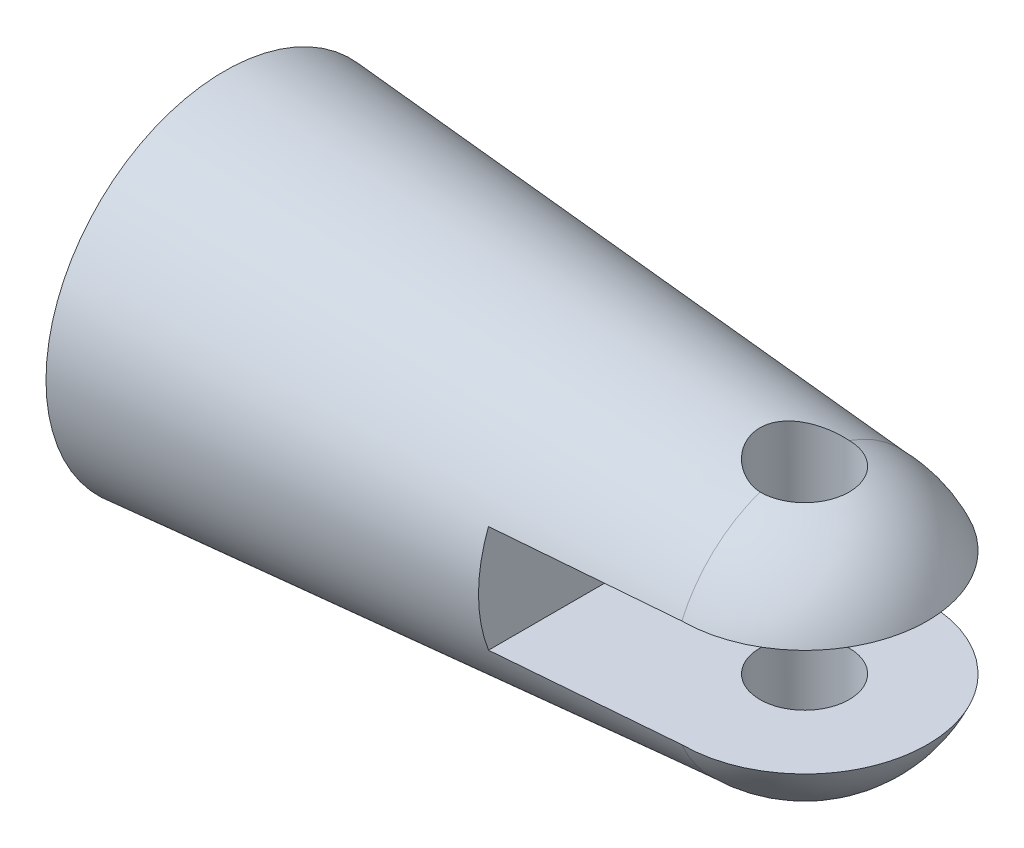
ISO-10303-21;
HEADER;
FILE_DESCRIPTION(('STEP AP214'),'2;1');
FILE_NAME('part.step','',(''),(''),'','','');
FILE_SCHEMA(('AUTOMOTIVE_DESIGN { 1 0 10303 214 1 1 1 1 }'));
ENDSEC;
DATA;
#1=APPLICATION_CONTEXT('core data for automotive mechanical design processes');
#2=APPLICATION_PROTOCOL_DEFINITION('international standard','automotive_design',2000,#1);
#3=PRODUCT_CONTEXT('',#1,'mechanical');
#4=PRODUCT('Part','Part','',(#3));
#5=PRODUCT_RELATED_PRODUCT_CATEGORY('part','',(#4));
#6=PRODUCT_DEFINITION_FORMATION('','',#4);
#7=PRODUCT_DEFINITION_CONTEXT('part definition',#1,'design');
#8=PRODUCT_DEFINITION('design','',#6,#7);
#9=PRODUCT_DEFINITION_SHAPE('','',#8);
#10=(LENGTH_UNIT() NAMED_UNIT(*) SI_UNIT(.MILLI.,.METRE.));
#11=(NAMED_UNIT(*) PLANE_ANGLE_UNIT() SI_UNIT($,.RADIAN.));
#12=(NAMED_UNIT(*) SI_UNIT($,.STERADIAN.) SOLID_ANGLE_UNIT());
#13=UNCERTAINTY_MEASURE_WITH_UNIT(LENGTH_MEASURE(1.E-05),#10,'distance_accuracy_value','');
#14=(GEOMETRIC_REPRESENTATION_CONTEXT(3) GLOBAL_UNCERTAINTY_ASSIGNED_CONTEXT((#13)) GLOBAL_UNIT_ASSIGNED_CONTEXT((#10,
#11,#12)) REPRESENTATION_CONTEXT('',''));
#15=CARTESIAN_POINT('',(0.,0.,0.));
#16=DIRECTION('',(0.,0.,1.));
#17=DIRECTION('',(1.,0.,0.));
#18=AXIS2_PLACEMENT_3D('',#15,#16,#17);
#19=CARTESIAN_POINT('',(65.,0.,0.));
#20=DIRECTION('',(-1.,0.,0.));
#21=DIRECTION('',(0.,0.,1.));
#22=AXIS2_PLACEMENT_3D('',#19,#20,#21);
#23=SPHERICAL_SURFACE('',#22,15.);
#24=CARTESIAN_POINT('',(65.,0.,0.));
#25=DIRECTION('',(-1.,0.,0.));
#26=DIRECTION('',(0.,0.,1.));
#27=AXIS2_PLACEMENT_3D('',#24,#25,#26);
#28=CIRCLE('',#27,15.);
#29=CARTESIAN_POINT('',(65.,-6.,-13.7477270848675));
#30=VERTEX_POINT('',#29);
#31=CARTESIAN_POINT('',(65.,-14.1421356237309,-5.));
#32=VERTEX_POINT('',#31);
#33=EDGE_CURVE('E166',#30,#32,#28,.T.);
#34=ORIENTED_EDGE('',*,*,#33,.F.);
#35=CARTESIAN_POINT('',(65.,-6.,0.));
#36=DIRECTION('',(0.,-1.,0.));
#37=DIRECTION('',(0.,0.,-1.));
#38=AXIS2_PLACEMENT_3D('',#35,#36,#37);
#39=CIRCLE('',#38,13.7477270848675);
#40=CARTESIAN_POINT('',(65.,-6.,13.7477270848675));
#41=VERTEX_POINT('',#40);
#42=EDGE_CURVE('E186',#30,#41,#39,.T.);
#43=ORIENTED_EDGE('',*,*,#42,.T.);
#44=CARTESIAN_POINT('',(65.,-14.1421356237309,5.));
#45=VERTEX_POINT('',#44);
#46=EDGE_CURVE('E167',#45,#41,#28,.T.);
#47=ORIENTED_EDGE('',*,*,#46,.F.);
#48=CARTESIAN_POINT('',(65.,-14.1421356237309,0.));
#49=DIRECTION('',(0.,1.,0.));
#50=DIRECTION('',(0.,0.,1.));
#51=AXIS2_PLACEMENT_3D('',#48,#49,#50);
#52=CIRCLE('',#51,5.);
#53=EDGE_CURVE('E54',#45,#32,#52,.T.);
#54=ORIENTED_EDGE('',*,*,#53,.T.);
#55=EDGE_LOOP('',(#34,#43,#47,#54));
#56=FACE_BOUND('',#55,.T.);
#57=ADVANCED_FACE('F32',(#56),#23,.T.);
#58=CARTESIAN_POINT('',(65.,-25.,0.));
#59=DIRECTION('',(0.,1.,0.));
#60=DIRECTION('',(0.,0.,1.));
#61=AXIS2_PLACEMENT_3D('',#58,#59,#60);
#62=CYLINDRICAL_SURFACE('',#61,5.);
#63=CARTESIAN_POINT('',(65.,-6.,0.));
#64=DIRECTION('',(0.,-1.,0.));
#65=DIRECTION('',(0.,0.,-1.));
#66=AXIS2_PLACEMENT_3D('',#63,#64,#65);
#67=CIRCLE('',#66,5.);
#68=CARTESIAN_POINT('',(65.,-6.,-5.));
#69=VERTEX_POINT('',#68);
#70=EDGE_CURVE('E104',#69,#69,#67,.F.);
#71=ORIENTED_EDGE('',*,*,#70,.T.);
#72=EDGE_LOOP('',(#71));
#73=FACE_BOUND('',#72,.T.);
#74=CARTESIAN_POINT('',(65.0002,-14.1421193072953,-4.999999996));
#75=CARTESIAN_POINT('',(64.8609005875466,-14.1534608437372,-5.0000225863422));
#76=CARTESIAN_POINT('',(64.7217923370571,-14.1668866167519,-4.99419041385577));
#77=CARTESIAN_POINT('',(64.445016799748,-14.1975948871605,-4.97103878691973));
#78=CARTESIAN_POINT('',(64.3073489732907,-14.2148758818136,-4.95372380322326));
#79=CARTESIAN_POINT('',(64.0348261194965,-14.2529330553083,-4.90789962909047));
#80=CARTESIAN_POINT('',(63.8999636940416,-14.273698230382,-4.87942531533224));
#81=CARTESIAN_POINT('',(63.6335479228229,-14.3183173494077,-4.81162390853048));
#82=CARTESIAN_POINT('',(63.5019948248338,-14.342171523821,-4.7722960054847));
#83=CARTESIAN_POINT('',(63.1138765137204,-14.4175786529937,-4.63866467403758));
#84=CARTESIAN_POINT('',(62.8632981289187,-14.4730564318507,-4.52861886940065));
#85=CARTESIAN_POINT('',(62.384368679171,-14.5898435089951,-4.2699792846608));
#86=CARTESIAN_POINT('',(62.156035358864,-14.6511573868381,-4.12135507170658));
#87=CARTESIAN_POINT('',(61.7170953084016,-14.7773734187937,-3.78191097099781));
#88=CARTESIAN_POINT('',(61.5077118530436,-14.8423146935315,-3.58952124686318));
#89=CARTESIAN_POINT('',(61.1238025041885,-14.9674864745691,-3.17105708064705));
#90=CARTESIAN_POINT('',(60.94927843781,-15.0277167338454,-2.94498087400758));
#91=CARTESIAN_POINT('',(60.7169860127176,-15.1106361221196,-2.58391323382069));
#92=CARTESIAN_POINT('',(60.6441864400282,-15.1371501511314,-2.45922940167486));
#93=CARTESIAN_POINT('',(60.5094265710204,-15.1869509830121,-2.20354201348524));
#94=CARTESIAN_POINT('',(60.4474615558479,-15.210239189924,-2.07254124058082));
#95=CARTESIAN_POINT('',(60.334959987426,-15.2530036865838,-1.80511880092982));
#96=CARTESIAN_POINT('',(60.2844239124051,-15.2724798168161,-1.66869690762459));
#97=CARTESIAN_POINT('',(60.1953322434207,-15.3071037620531,-1.39152484233197));
#98=CARTESIAN_POINT('',(60.1567707485258,-15.3222537086531,-1.25077683990067));
#99=CARTESIAN_POINT('',(60.0939583186109,-15.3470686079975,-0.974485122996998));
#100=CARTESIAN_POINT('',(60.0689945363965,-15.3570054826469,-0.839127535155646));
#101=CARTESIAN_POINT('',(60.0303049449088,-15.3724500042564,-0.566621106993163));
#102=CARTESIAN_POINT('',(60.016574211302,-15.3779595920277,-0.429473078381503));
#103=CARTESIAN_POINT('',(60.0004864780599,-15.384418087117,-0.15441280113628));
#104=CARTESIAN_POINT('',(59.9981287958165,-15.3853672681498,-0.0165005988656904));
#105=CARTESIAN_POINT('',(60.0048119493913,-15.3826816663833,0.259000611715447));
#106=CARTESIAN_POINT('',(60.013852497281,-15.3790469993758,0.396589628101971));
#107=CARTESIAN_POINT('',(60.0424995253958,-15.3675781841497,0.663557253225277));
#108=CARTESIAN_POINT('',(60.0615591513602,-15.3599614880038,0.793004349349737));
#109=CARTESIAN_POINT('',(60.1096984642036,-15.3408402213671,1.04977158485662));
#110=CARTESIAN_POINT('',(60.1387814910877,-15.3293343549487,1.17709100040544));
#111=CARTESIAN_POINT('',(60.206686844041,-15.3026896875985,1.42867536269365));
#112=CARTESIAN_POINT('',(60.2455059968721,-15.2875520704115,1.55294129017765));
#113=CARTESIAN_POINT('',(60.3325387199748,-15.2539684267451,1.79769427079882));
#114=CARTESIAN_POINT('',(60.3807558518708,-15.2355211461885,1.91817987111528));
#115=CARTESIAN_POINT('',(60.5410583139958,-15.174966475539,2.27759399406916));
#116=CARTESIAN_POINT('',(60.6674588144673,-15.1281874213997,2.50954528441505));
#117=CARTESIAN_POINT('',(60.9539725990488,-15.0261839899758,2.94935465283195));
#118=CARTESIAN_POINT('',(61.114095894487,-14.970957106109,3.15720554771282));
#119=CARTESIAN_POINT('',(61.4755186048973,-14.8525304287999,3.55744075823097));
#120=CARTESIAN_POINT('',(61.6788221560584,-14.7890455678859,3.74793276893805));
#121=CARTESIAN_POINT('',(62.1145163598661,-14.6625540751018,4.09281675934621));
#122=CARTESIAN_POINT('',(62.3469233271463,-14.5995477326551,4.24718835052858));
#123=CARTESIAN_POINT('',(62.717495282686,-14.50836869236,4.45096578748352));
#124=CARTESIAN_POINT('',(62.8472112755162,-14.4780201112727,4.51514139961249));
#125=CARTESIAN_POINT('',(63.1121332569952,-14.4196040907575,4.63215893520772));
#126=CARTESIAN_POINT('',(63.2473370167758,-14.3915357388412,4.68500540631588));
#127=CARTESIAN_POINT('',(63.5221686367712,-14.3383758453878,4.77881550778364));
#128=CARTESIAN_POINT('',(63.661790603614,-14.3132805340369,4.8197942837722));
#129=CARTESIAN_POINT('',(63.9445764469822,-14.2666235530336,4.88950647954905));
#130=CARTESIAN_POINT('',(64.0877385523473,-14.2450601559178,4.91824589669402));
#131=CARTESIAN_POINT('',(64.3588410406606,-14.2083528037028,4.96037789081176));
#132=CARTESIAN_POINT('',(64.4864950220597,-14.1927458966252,4.97522032786196));
#133=CARTESIAN_POINT('',(64.74277862676,-14.1648762323326,4.9950344752248));
#134=CARTESIAN_POINT('',(64.871406968408,-14.1526096738722,5.00001744622238));
#135=CARTESIAN_POINT('',(65.0002,-14.1421193072953,4.999999996));
#136=B_SPLINE_CURVE_WITH_KNOTS('',3,(#74,#75,#76,#77,#78,#79,#80,#81,#82,#83,#84,#85,#86,#87,
#88,#89,#90,#91,#92,#93,#94,#95,#96,#97,#98,#99,#100,#101,#102,#103,#104,#105,#106,#107,#108,
#109,#110,#111,#112,#113,#114,#115,#116,#117,#118,#119,#120,#121,#122,#123,#124,#125,#126,#127,
#128,#129,#130,#131,#132,#133,#134,#135),.UNSPECIFIED.,.F.,.F.,(4,2,2,2,2,2,2,2,2,2,2,2,2,2,2,2,
2,2,2,2,2,2,2,2,2,2,2,2,2,2,4),(0.,0.419109986977874,0.838056892105409,1.25570475636498,
1.67338379807427,2.50705933012206,3.34139452233439,4.21246806699396,5.08358725608813,
5.52350086127665,5.96322238781629,6.40296231049794,6.84248518940088,7.25595193962768,
7.66923733740647,8.08249792957055,8.49574808264965,8.88848145927065,9.28134582952969,
9.67408232183646,10.0669679429257,10.8679803862637,11.6692309632158,12.5227287522758,
13.3767071504001,13.8198593583499,14.2628333456567,14.7052394900283,15.1474286027029,
15.5353886656417,15.9229053756085),.UNSPECIFIED.);
#137=EDGE_CURVE('E133',#32,#45,#136,.T.);
#138=ORIENTED_EDGE('',*,*,#137,.F.);
#139=ORIENTED_EDGE('',*,*,#53,.F.);
#140=EDGE_LOOP('',(#138,#139));
#141=FACE_BOUND('',#140,.T.);
#142=ADVANCED_FACE('F200',(#73,#141),#62,.F.);
#143=CARTESIAN_POINT('',(0.,0.,0.));
#144=DIRECTION('',(1.,0.,0.));
#145=DIRECTION('',(0.,0.,-1.));
#146=AXIS2_PLACEMENT_3D('',#143,#144,#145);
#147=PLANE('',#146);
#148=CARTESIAN_POINT('',(0.,0.,0.));
#149=DIRECTION('',(-1.,0.,0.));
#150=DIRECTION('',(0.,0.,1.));
#151=AXIS2_PLACEMENT_3D('',#148,#149,#150);
#152=CIRCLE('',#151,20.);
#153=CARTESIAN_POINT('',(0.,0.,20.));
#154=VERTEX_POINT('',#153);
#155=EDGE_CURVE('E170',#154,#154,#152,.T.);
#156=ORIENTED_EDGE('',*,*,#155,.T.);
#157=EDGE_LOOP('',(#156));
#158=FACE_BOUND('',#157,.T.);
#159=CARTESIAN_POINT('',(0.,0.,0.));
#160=DIRECTION('',(1.,0.,0.));
#161=DIRECTION('',(0.,0.,-1.));
#162=AXIS2_PLACEMENT_3D('',#159,#160,#161);
#163=CIRCLE('',#162,8.);
#164=CARTESIAN_POINT('',(0.,0.,-8.));
#165=VERTEX_POINT('',#164);
#166=EDGE_CURVE('E159',#165,#165,#163,.F.);
#167=ORIENTED_EDGE('',*,*,#166,.F.);
#168=EDGE_LOOP('',(#167));
#169=FACE_BOUND('',#168,.T.);
#170=ADVANCED_FACE('F128',(#158,#169),#147,.F.);
#171=CARTESIAN_POINT('',(65.,6.,13.7477270848675));
#172=VERTEX_POINT('',#171);
#173=CARTESIAN_POINT('',(65.,14.1421356237309,5.));
#174=VERTEX_POINT('',#173);
#175=EDGE_CURVE('E168',#172,#174,#28,.T.);
#176=ORIENTED_EDGE('',*,*,#175,.F.);
#177=CARTESIAN_POINT('',(65.,6.,0.));
#178=DIRECTION('',(0.,1.,0.));
#179=DIRECTION('',(0.,0.,1.));
#180=AXIS2_PLACEMENT_3D('',#177,#178,#179);
#181=CIRCLE('',#180,13.7477270848675);
#182=CARTESIAN_POINT('',(65.,6.,-13.7477270848675));
#183=VERTEX_POINT('',#182);
#184=EDGE_CURVE('E47',#172,#183,#181,.T.);
#185=ORIENTED_EDGE('',*,*,#184,.T.);
#186=CARTESIAN_POINT('',(65.,14.1421356237309,-5.));
#187=VERTEX_POINT('',#186);
#188=EDGE_CURVE('E103',#187,#183,#28,.T.);
#189=ORIENTED_EDGE('',*,*,#188,.F.);
#190=CARTESIAN_POINT('',(65.,14.1421356237309,0.));
#191=DIRECTION('',(0.,-1.,0.));
#192=DIRECTION('',(0.,0.,-1.));
#193=AXIS2_PLACEMENT_3D('',#190,#191,#192);
#194=CIRCLE('',#193,5.);
#195=EDGE_CURVE('E173',#187,#174,#194,.T.);
#196=ORIENTED_EDGE('',*,*,#195,.T.);
#197=EDGE_LOOP('',(#176,#185,#189,#196));
#198=FACE_BOUND('',#197,.T.);
#199=ADVANCED_FACE('F34',(#198),#23,.T.);
#200=CARTESIAN_POINT('',(65.,0.,0.));
#201=DIRECTION('',(-1.,0.,0.));
#202=DIRECTION('',(0.,0.,1.));
#203=AXIS2_PLACEMENT_3D('',#200,#201,#202);
#204=CONICAL_SURFACE('',#203,15.,0.0767718912697781);
#205=ORIENTED_EDGE('',*,*,#155,.F.);
#206=EDGE_LOOP('',(#205));
#207=FACE_BOUND('',#206,.T.);
#208=CARTESIAN_POINT('',(45.,0.,0.));
#209=DIRECTION('',(-1.,0.,0.));
#210=DIRECTION('',(0.,0.,1.));
#211=AXIS2_PLACEMENT_3D('',#208,#209,#210);
#212=CIRCLE('',#211,16.5384615384615);
#213=CARTESIAN_POINT('',(45.,6.,-15.4117069158212));
#214=VERTEX_POINT('',#213);
#215=CARTESIAN_POINT('',(45.,-6.,-15.4117069158212));
#216=VERTEX_POINT('',#215);
#217=EDGE_CURVE('E11',#214,#216,#212,.T.);
#218=ORIENTED_EDGE('',*,*,#217,.T.);
#219=CARTESIAN_POINT('',(20.1838855460255,-6.,-17.4443780048232));
#220=CARTESIAN_POINT('',(22.6752362266929,-6.,-17.2417142039206));
#221=CARTESIAN_POINT('',(25.166557124428,-6.,-17.0386838708327));
#222=CARTESIAN_POINT('',(30.1491299382822,-6.,-16.6317964745356));
#223=CARTESIAN_POINT('',(32.6403818544409,-6.,-16.4279394118091));
#224=CARTESIAN_POINT('',(37.6228350791058,-6.,-16.0193026134696));
#225=CARTESIAN_POINT('',(40.1140363868582,-6.,-15.8145228686618));
#226=CARTESIAN_POINT('',(45.0963552856323,-6.,-15.4039289947091));
#227=CARTESIAN_POINT('',(47.5874728766028,-6.,-15.1981148649411));
#228=CARTESIAN_POINT('',(52.5696118898569,-6.,-14.7853197599336));
#229=CARTESIAN_POINT('',(55.0606333121219,-6.,-14.5783387844682));
#230=CARTESIAN_POINT('',(60.0425613594646,-6.,-14.1630528231513));
#231=CARTESIAN_POINT('',(62.5334679847383,-6.,-13.9547478396513));
#232=CARTESIAN_POINT('',(67.5151281279363,-6.,-13.5366276119879));
#233=CARTESIAN_POINT('',(70.0058816471965,-6.,-13.3268123837511));
#234=CARTESIAN_POINT('',(73.7419088931162,-6.,-13.0107831233733));
#235=CARTESIAN_POINT('',(74.9872378588633,-6.,-12.9052219827289));
#236=CARTESIAN_POINT('',(77.4778565922245,-6.,-12.6936300159522));
#237=CARTESIAN_POINT('',(78.7231463598158,-6.,-12.5875991895507));
#238=CARTESIAN_POINT('',(83.6637149782647,-6.,-12.1659259497749));
#239=CARTESIAN_POINT('',(87.3588264657151,-6.,-11.8483184522033));
#240=CARTESIAN_POINT('',(94.7485528914345,-6.,-11.2074953655305));
#241=CARTESIAN_POINT('',(98.4431678311299,-6.,-10.8842797929034));
#242=CARTESIAN_POINT('',(105.831628120334,-6.,-10.2305659997617));
#243=CARTESIAN_POINT('',(109.525473491677,-6.,-9.900068026369));
#244=CARTESIAN_POINT('',(116.912329108889,-6.,-9.22932070591741));
#245=CARTESIAN_POINT('',(120.605339343859,-6.,-8.8890712382497));
#246=CARTESIAN_POINT('',(126.144153535325,-6.,-8.36838680080065));
#247=CARTESIAN_POINT('',(127.990440775742,-6.,-8.193093976577));
#248=CARTESIAN_POINT('',(131.682610896746,-6.,-7.83833226658255));
#249=CARTESIAN_POINT('',(133.528493778147,-6.,-7.65886338929636));
#250=CARTESIAN_POINT('',(137.219688319826,-6.,-7.29480642751622));
#251=CARTESIAN_POINT('',(139.064999998366,-6.,-7.11021852861513));
#252=CARTESIAN_POINT('',(142.754982129393,-6.,-6.73459356740881));
#253=CARTESIAN_POINT('',(144.599652576957,-6.,-6.54355645666518));
#254=CARTESIAN_POINT('',(148.28841044889,-6.,-6.15314020428585));
#255=CARTESIAN_POINT('',(150.132497735211,-6.,-5.95375975023381));
#256=CARTESIAN_POINT('',(152.897676077467,-6.,-5.64629298492842));
#257=CARTESIAN_POINT('',(153.819234124576,-6.,-5.54240580739044));
#258=CARTESIAN_POINT('',(155.661972785547,-6.,-5.33130774490374));
#259=CARTESIAN_POINT('',(156.583153398389,-6.,-5.22409685103182));
#260=CARTESIAN_POINT('',(158.425161766184,-6.,-5.00568645949145));
#261=CARTESIAN_POINT('',(159.345989461279,-6.,-4.89448645572842));
#262=CARTESIAN_POINT('',(161.187039897176,-6.,-4.66723220613629));
#263=CARTESIAN_POINT('',(162.107262642539,-6.,-4.55117799734765));
#264=CARTESIAN_POINT('',(163.946991703178,-6.,-4.31300171652589));
#265=CARTESIAN_POINT('',(164.86649796487,-6.,-4.19087922801773));
#266=CARTESIAN_POINT('',(166.244964124536,-6.,-4.00182306145637));
#267=CARTESIAN_POINT('',(166.70432661515,-6.,-3.93782472874468));
#268=CARTESIAN_POINT('',(167.62273074361,-6.,-3.8075467203223));
#269=CARTESIAN_POINT('',(168.081772379358,-6.,-3.74126702982726));
#270=CARTESIAN_POINT('',(168.540624390155,-6.,-3.67368491701222));
#271=B_SPLINE_CURVE_WITH_KNOTS('',3,(#219,#220,#221,#222,#223,#224,#225,#226,#227,#228,#229,
#230,#231,#232,#233,#234,#235,#236,#237,#238,#239,#240,#241,#242,#243,#244,#245,#246,#247,#248,
#249,#250,#251,#252,#253,#254,#255,#256,#257,#258,#259,#260,#261,#262,#263,#264,#265,#266,#267,
#268,#269,#270),.UNSPECIFIED.,.F.,.F.,(4,2,2,2,2,2,2,2,2,2,2,2,2,2,2,2,2,2,2,2,2,2,2,2,2,4),(0.,
7.49874041461379,14.9974764521935,22.4962873842394,29.995102835562,37.4939197389478,
44.9927233271471,52.4914479504303,56.2408326787794,59.9902195553436,71.1164243402982,
82.2425964466366,93.3683915757688,104.49432437083,110.058090778481,115.621845883056,
121.185399533743,126.748994980161,132.313468899936,135.095649663289,137.87783789663,
140.66038036062,143.442901596037,146.225614064489,147.617006533884,149.008408021901),.UNSPECIFIED.);
#272=EDGE_CURVE('E182',#216,#30,#271,.T.);
#273=ORIENTED_EDGE('',*,*,#272,.T.);
#274=ORIENTED_EDGE('',*,*,#33,.T.);
#275=ORIENTED_EDGE('',*,*,#137,.T.);
#276=ORIENTED_EDGE('',*,*,#46,.T.);
#277=CARTESIAN_POINT('',(20.1838855460255,-6.,17.4443780048232));
#278=CARTESIAN_POINT('',(22.6752362266929,-6.,17.2417142039206));
#279=CARTESIAN_POINT('',(25.166557124428,-6.,17.0386838708327));
#280=CARTESIAN_POINT('',(30.1491299382822,-6.,16.6317964745356));
#281=CARTESIAN_POINT('',(32.6403818544409,-6.,16.4279394118091));
#282=CARTESIAN_POINT('',(37.6228350791058,-6.,16.0193026134696));
#283=CARTESIAN_POINT('',(40.1140363868582,-6.,15.8145228686618));
#284=CARTESIAN_POINT('',(45.0963552856323,-6.,15.4039289947091));
#285=CARTESIAN_POINT('',(47.5874728766028,-6.,15.1981148649411));
#286=CARTESIAN_POINT('',(52.5696118898569,-6.,14.7853197599336));
#287=CARTESIAN_POINT('',(55.0606333121219,-6.,14.5783387844682));
#288=CARTESIAN_POINT('',(60.0425613594646,-6.,14.1630528231513));
#289=CARTESIAN_POINT('',(62.5334679847383,-6.,13.9547478396513));
#290=CARTESIAN_POINT('',(67.5151281279363,-6.,13.5366276119879));
#291=CARTESIAN_POINT('',(70.0058816471965,-6.,13.3268123837511));
#292=CARTESIAN_POINT('',(73.7419088931162,-6.,13.0107831233733));
#293=CARTESIAN_POINT('',(74.9872378588633,-6.,12.9052219827289));
#294=CARTESIAN_POINT('',(77.4778565922245,-6.,12.6936300159522));
#295=CARTESIAN_POINT('',(78.7231463598158,-6.,12.5875991895507));
#296=CARTESIAN_POINT('',(83.6637149782647,-6.,12.1659259497749));
#297=CARTESIAN_POINT('',(87.3588264657151,-6.,11.8483184522033));
#298=CARTESIAN_POINT('',(94.7485528914345,-6.,11.2074953655305));
#299=CARTESIAN_POINT('',(98.4431678311299,-6.,10.8842797929034));
#300=CARTESIAN_POINT('',(105.831628120334,-6.,10.2305659997617));
#301=CARTESIAN_POINT('',(109.525473491677,-6.,9.900068026369));
#302=CARTESIAN_POINT('',(116.912329108889,-6.,9.22932070591741));
#303=CARTESIAN_POINT('',(120.605339343859,-6.,8.8890712382497));
#304=CARTESIAN_POINT('',(126.144153535325,-6.,8.36838680080065));
#305=CARTESIAN_POINT('',(127.990440775742,-6.,8.193093976577));
#306=CARTESIAN_POINT('',(131.682610896746,-6.,7.83833226658255));
#307=CARTESIAN_POINT('',(133.528493778147,-6.,7.65886338929636));
#308=CARTESIAN_POINT('',(137.219688319826,-6.,7.29480642751622));
#309=CARTESIAN_POINT('',(139.064999998366,-6.,7.11021852861513));
#310=CARTESIAN_POINT('',(142.754982129393,-6.,6.73459356740881));
#311=CARTESIAN_POINT('',(144.599652576957,-6.,6.54355645666518));
#312=CARTESIAN_POINT('',(148.28841044889,-6.,6.15314020428585));
#313=CARTESIAN_POINT('',(150.132497735211,-6.,5.95375975023381));
#314=CARTESIAN_POINT('',(152.897676077467,-6.,5.64629298492842));
#315=CARTESIAN_POINT('',(153.819234124576,-6.,5.54240580739044));
#316=CARTESIAN_POINT('',(155.661972785547,-6.,5.33130774490374));
#317=CARTESIAN_POINT('',(156.583153398389,-6.,5.22409685103182));
#318=CARTESIAN_POINT('',(158.425161766184,-6.,5.00568645949145));
#319=CARTESIAN_POINT('',(159.345989461279,-6.,4.89448645572842));
#320=CARTESIAN_POINT('',(161.187039897176,-6.,4.66723220613629));
#321=CARTESIAN_POINT('',(162.107262642539,-6.,4.55117799734765));
#322=CARTESIAN_POINT('',(163.946991703178,-6.,4.31300171652589));
#323=CARTESIAN_POINT('',(164.86649796487,-6.,4.19087922801773));
#324=CARTESIAN_POINT('',(166.244964124536,-6.,4.00182306145637));
#325=CARTESIAN_POINT('',(166.70432661515,-6.,3.93782472874468));
#326=CARTESIAN_POINT('',(167.62273074361,-6.,3.8075467203223));
#327=CARTESIAN_POINT('',(168.081772379358,-6.,3.74126702982726));
#328=CARTESIAN_POINT('',(168.540624390155,-6.,3.67368491701222));
#329=B_SPLINE_CURVE_WITH_KNOTS('',3,(#277,#278,#279,#280,#281,#282,#283,#284,#285,#286,#287,
#288,#289,#290,#291,#292,#293,#294,#295,#296,#297,#298,#299,#300,#301,#302,#303,#304,#305,#306,
#307,#308,#309,#310,#311,#312,#313,#314,#315,#316,#317,#318,#319,#320,#321,#322,#323,#324,#325,
#326,#327,#328),.UNSPECIFIED.,.F.,.F.,(4,2,2,2,2,2,2,2,2,2,2,2,2,2,2,2,2,2,2,2,2,2,2,2,2,4),(0.,
7.49874041461379,14.9974764521935,22.4962873842394,29.995102835562,37.4939197389478,
44.9927233271471,52.4914479504303,56.2408326787794,59.9902195553436,71.1164243402982,
82.2425964466366,93.3683915757688,104.49432437083,110.058090778481,115.621845883056,
121.185399533743,126.748994980161,132.313468899936,135.095649663289,137.87783789663,
140.66038036062,143.442901596037,146.225614064489,147.617006533884,149.008408021901),.UNSPECIFIED.);
#330=CARTESIAN_POINT('',(45.,-6.,15.4117069158212));
#331=VERTEX_POINT('',#330);
#332=EDGE_CURVE('E107',#41,#331,#329,.F.);
#333=ORIENTED_EDGE('',*,*,#332,.T.);
#334=CARTESIAN_POINT('',(45.,6.,15.4117069158212));
#335=VERTEX_POINT('',#334);
#336=EDGE_CURVE('E36',#331,#335,#212,.T.);
#337=ORIENTED_EDGE('',*,*,#336,.T.);
#338=CARTESIAN_POINT('',(20.1838855460255,6.,17.4443780048232));
#339=CARTESIAN_POINT('',(22.6752362266929,6.,17.2417142039206));
#340=CARTESIAN_POINT('',(25.166557124428,6.,17.0386838708327));
#341=CARTESIAN_POINT('',(30.1491299382822,6.,16.6317964745356));
#342=CARTESIAN_POINT('',(32.6403818544409,6.,16.4279394118091));
#343=CARTESIAN_POINT('',(37.6228350791058,6.,16.0193026134696));
#344=CARTESIAN_POINT('',(40.1140363868582,6.,15.8145228686618));
#345=CARTESIAN_POINT('',(45.0963552856323,6.,15.4039289947091));
#346=CARTESIAN_POINT('',(47.5874728766028,6.,15.1981148649411));
#347=CARTESIAN_POINT('',(52.5696118898569,6.,14.7853197599336));
#348=CARTESIAN_POINT('',(55.0606333121219,6.,14.5783387844682));
#349=CARTESIAN_POINT('',(60.0425613594646,6.,14.1630528231513));
#350=CARTESIAN_POINT('',(62.5334679847383,6.,13.9547478396513));
#351=CARTESIAN_POINT('',(67.5151281279363,6.,13.5366276119879));
#352=CARTESIAN_POINT('',(70.0058816471965,6.,13.3268123837511));
#353=CARTESIAN_POINT('',(73.7419088931162,6.,13.0107831233733));
#354=CARTESIAN_POINT('',(74.9872378588633,6.,12.9052219827289));
#355=CARTESIAN_POINT('',(77.4778565922245,6.,12.6936300159522));
#356=CARTESIAN_POINT('',(78.7231463598158,6.,12.5875991895507));
#357=CARTESIAN_POINT('',(83.6637149782647,6.,12.1659259497749));
#358=CARTESIAN_POINT('',(87.3588264657151,6.,11.8483184522033));
#359=CARTESIAN_POINT('',(94.7485528914345,6.,11.2074953655305));
#360=CARTESIAN_POINT('',(98.4431678311299,6.,10.8842797929034));
#361=CARTESIAN_POINT('',(105.831628120334,6.,10.2305659997617));
#362=CARTESIAN_POINT('',(109.525473491677,6.,9.900068026369));
#363=CARTESIAN_POINT('',(116.912329108889,6.,9.22932070591741));
#364=CARTESIAN_POINT('',(120.605339343859,6.,8.8890712382497));
#365=CARTESIAN_POINT('',(126.144153535325,6.,8.36838680080065));
#366=CARTESIAN_POINT('',(127.990440775742,6.,8.193093976577));
#367=CARTESIAN_POINT('',(131.682610896746,6.,7.83833226658255));
#368=CARTESIAN_POINT('',(133.528493778147,6.,7.65886338929636));
#369=CARTESIAN_POINT('',(137.219688319826,6.,7.29480642751622));
#370=CARTESIAN_POINT('',(139.064999998366,6.,7.11021852861513));
#371=CARTESIAN_POINT('',(142.754982129393,6.,6.73459356740881));
#372=CARTESIAN_POINT('',(144.599652576957,6.,6.54355645666518));
#373=CARTESIAN_POINT('',(148.28841044889,6.,6.15314020428585));
#374=CARTESIAN_POINT('',(150.132497735211,6.,5.95375975023381));
#375=CARTESIAN_POINT('',(152.897676077467,6.,5.64629298492842));
#376=CARTESIAN_POINT('',(153.819234124576,6.,5.54240580739044));
#377=CARTESIAN_POINT('',(155.661972785547,6.,5.33130774490374));
#378=CARTESIAN_POINT('',(156.583153398389,6.,5.22409685103182));
#379=CARTESIAN_POINT('',(158.425161766184,6.,5.00568645949145));
#380=CARTESIAN_POINT('',(159.345989461279,6.,4.89448645572842));
#381=CARTESIAN_POINT('',(161.187039897176,6.,4.66723220613629));
#382=CARTESIAN_POINT('',(162.107262642539,6.,4.55117799734765));
#383=CARTESIAN_POINT('',(163.946991703178,6.,4.31300171652589));
#384=CARTESIAN_POINT('',(164.86649796487,6.,4.19087922801773));
#385=CARTESIAN_POINT('',(166.244964124536,6.,4.00182306145637));
#386=CARTESIAN_POINT('',(166.70432661515,6.,3.93782472874468));
#387=CARTESIAN_POINT('',(167.62273074361,6.,3.8075467203223));
#388=CARTESIAN_POINT('',(168.081772379358,6.,3.74126702982726));
#389=CARTESIAN_POINT('',(168.540624390155,6.,3.67368491701222));
#390=B_SPLINE_CURVE_WITH_KNOTS('',3,(#338,#339,#340,#341,#342,#343,#344,#345,#346,#347,#348,
#349,#350,#351,#352,#353,#354,#355,#356,#357,#358,#359,#360,#361,#362,#363,#364,#365,#366,#367,
#368,#369,#370,#371,#372,#373,#374,#375,#376,#377,#378,#379,#380,#381,#382,#383,#384,#385,#386,
#387,#388,#389),.UNSPECIFIED.,.F.,.F.,(4,2,2,2,2,2,2,2,2,2,2,2,2,2,2,2,2,2,2,2,2,2,2,2,2,4),(0.,
7.49874041461379,14.9974764521935,22.4962873842394,29.995102835562,37.4939197389478,
44.9927233271471,52.4914479504303,56.2408326787794,59.9902195553436,71.1164243402982,
82.2425964466366,93.3683915757688,104.49432437083,110.058090778481,115.621845883056,
121.185399533743,126.748994980161,132.313468899936,135.095649663289,137.87783789663,
140.66038036062,143.442901596037,146.225614064489,147.617006533884,149.008408021901),.UNSPECIFIED.);
#391=EDGE_CURVE('E97',#335,#172,#390,.T.);
#392=ORIENTED_EDGE('',*,*,#391,.T.);
#393=ORIENTED_EDGE('',*,*,#175,.T.);
#394=CARTESIAN_POINT('',(65.0002,14.1421193072953,4.999999996));
#395=CARTESIAN_POINT('',(64.8609005875466,14.1534608437372,5.0000225863422));
#396=CARTESIAN_POINT('',(64.7217923370571,14.1668866167519,4.99419041385577));
#397=CARTESIAN_POINT('',(64.445016799748,14.1975948871605,4.97103878691973));
#398=CARTESIAN_POINT('',(64.3073489732907,14.2148758818136,4.95372380322326));
#399=CARTESIAN_POINT('',(64.0348261194965,14.2529330553083,4.90789962909047));
#400=CARTESIAN_POINT('',(63.8999636940416,14.273698230382,4.87942531533224));
#401=CARTESIAN_POINT('',(63.6335479228229,14.3183173494077,4.81162390853048));
#402=CARTESIAN_POINT('',(63.5019948248338,14.342171523821,4.7722960054847));
#403=CARTESIAN_POINT('',(63.1138765137204,14.4175786529937,4.63866467403758));
#404=CARTESIAN_POINT('',(62.8632981289187,14.4730564318507,4.52861886940065));
#405=CARTESIAN_POINT('',(62.384368679171,14.5898435089951,4.2699792846608));
#406=CARTESIAN_POINT('',(62.156035358864,14.6511573868381,4.12135507170658));
#407=CARTESIAN_POINT('',(61.7170953084016,14.7773734187937,3.78191097099781));
#408=CARTESIAN_POINT('',(61.5077118530436,14.8423146935315,3.58952124686318));
#409=CARTESIAN_POINT('',(61.1238025041885,14.9674864745691,3.17105708064705));
#410=CARTESIAN_POINT('',(60.94927843781,15.0277167338454,2.94498087400758));
#411=CARTESIAN_POINT('',(60.7169860127176,15.1106361221196,2.58391323382069));
#412=CARTESIAN_POINT('',(60.6441864400282,15.1371501511314,2.45922940167486));
#413=CARTESIAN_POINT('',(60.5094265710204,15.1869509830121,2.20354201348524));
#414=CARTESIAN_POINT('',(60.4474615558479,15.210239189924,2.07254124058082));
#415=CARTESIAN_POINT('',(60.334959987426,15.2530036865838,1.80511880092982));
#416=CARTESIAN_POINT('',(60.2844239124051,15.2724798168161,1.66869690762459));
#417=CARTESIAN_POINT('',(60.1953322434207,15.3071037620531,1.39152484233197));
#418=CARTESIAN_POINT('',(60.1567707485258,15.3222537086531,1.25077683990067));
#419=CARTESIAN_POINT('',(60.0939583186109,15.3470686079975,0.974485122996998));
#420=CARTESIAN_POINT('',(60.0689945363965,15.3570054826469,0.839127535155646));
#421=CARTESIAN_POINT('',(60.0303049449088,15.3724500042564,0.566621106993163));
#422=CARTESIAN_POINT('',(60.016574211302,15.3779595920277,0.429473078381503));
#423=CARTESIAN_POINT('',(60.0004864780599,15.384418087117,0.15441280113628));
#424=CARTESIAN_POINT('',(59.9981287958165,15.3853672681498,0.0165005988656904));
#425=CARTESIAN_POINT('',(60.0048119493913,15.3826816663833,-0.259000611715447));
#426=CARTESIAN_POINT('',(60.013852497281,15.3790469993758,-0.396589628101971));
#427=CARTESIAN_POINT('',(60.0424995253958,15.3675781841497,-0.663557253225277));
#428=CARTESIAN_POINT('',(60.0615591513602,15.3599614880038,-0.793004349349737));
#429=CARTESIAN_POINT('',(60.1096984642036,15.3408402213671,-1.04977158485662));
#430=CARTESIAN_POINT('',(60.1387814910877,15.3293343549487,-1.17709100040544));
#431=CARTESIAN_POINT('',(60.206686844041,15.3026896875985,-1.42867536269365));
#432=CARTESIAN_POINT('',(60.2455059968721,15.2875520704115,-1.55294129017765));
#433=CARTESIAN_POINT('',(60.3325387199748,15.2539684267451,-1.79769427079882));
#434=CARTESIAN_POINT('',(60.3807558518708,15.2355211461885,-1.91817987111528));
#435=CARTESIAN_POINT('',(60.5410583139958,15.174966475539,-2.27759399406916));
#436=CARTESIAN_POINT('',(60.6674588144673,15.1281874213997,-2.50954528441505));
#437=CARTESIAN_POINT('',(60.9539725990488,15.0261839899758,-2.94935465283195));
#438=CARTESIAN_POINT('',(61.114095894487,14.970957106109,-3.15720554771282));
#439=CARTESIAN_POINT('',(61.4755186048973,14.8525304287999,-3.55744075823097));
#440=CARTESIAN_POINT('',(61.6788221560584,14.7890455678859,-3.74793276893805));
#441=CARTESIAN_POINT('',(62.1145163598661,14.6625540751018,-4.09281675934621));
#442=CARTESIAN_POINT('',(62.3469233271463,14.5995477326551,-4.24718835052858));
#443=CARTESIAN_POINT('',(62.717495282686,14.50836869236,-4.45096578748352));
#444=CARTESIAN_POINT('',(62.8472112755162,14.4780201112727,-4.51514139961249));
#445=CARTESIAN_POINT('',(63.1121332569952,14.4196040907575,-4.63215893520772));
#446=CARTESIAN_POINT('',(63.2473370167758,14.3915357388412,-4.68500540631588));
#447=CARTESIAN_POINT('',(63.5221686367712,14.3383758453878,-4.77881550778364));
#448=CARTESIAN_POINT('',(63.661790603614,14.3132805340369,-4.8197942837722));
#449=CARTESIAN_POINT('',(63.9445764469822,14.2666235530336,-4.88950647954905));
#450=CARTESIAN_POINT('',(64.0877385523473,14.2450601559178,-4.91824589669402));
#451=CARTESIAN_POINT('',(64.3588410406606,14.2083528037028,-4.96037789081176));
#452=CARTESIAN_POINT('',(64.4864950220597,14.1927458966252,-4.97522032786196));
#453=CARTESIAN_POINT('',(64.74277862676,14.1648762323326,-4.9950344752248));
#454=CARTESIAN_POINT('',(64.871406968408,14.1526096738722,-5.00001744622238));
#455=CARTESIAN_POINT('',(65.0002,14.1421193072953,-4.999999996));
#456=B_SPLINE_CURVE_WITH_KNOTS('',3,(#394,#395,#396,#397,#398,#399,#400,#401,#402,#403,#404,
#405,#406,#407,#408,#409,#410,#411,#412,#413,#414,#415,#416,#417,#418,#419,#420,#421,#422,#423,
#424,#425,#426,#427,#428,#429,#430,#431,#432,#433,#434,#435,#436,#437,#438,#439,#440,#441,#442,
#443,#444,#445,#446,#447,#448,#449,#450,#451,#452,#453,#454,#455),.UNSPECIFIED.,.F.,.F.,(4,2,2,
2,2,2,2,2,2,2,2,2,2,2,2,2,2,2,2,2,2,2,2,2,2,2,2,2,2,2,4),(0.,0.419109986977874,
0.838056892105409,1.25570475636498,1.67338379807427,2.50705933012206,3.34139452233439,
4.21246806699396,5.08358725608813,5.52350086127665,5.96322238781629,6.40296231049794,
6.84248518940088,7.25595193962768,7.66923733740647,8.08249792957055,8.49574808264965,
8.88848145927065,9.28134582952969,9.67408232183646,10.0669679429257,10.8679803862637,
11.6692309632158,12.5227287522758,13.3767071504001,13.8198593583499,14.2628333456567,
14.7052394900283,15.1474286027029,15.5353886656417,15.9229053756085),.UNSPECIFIED.);
#457=EDGE_CURVE('E142',#174,#187,#456,.T.);
#458=ORIENTED_EDGE('',*,*,#457,.T.);
#459=ORIENTED_EDGE('',*,*,#188,.T.);
#460=CARTESIAN_POINT('',(20.1838855460255,6.,-17.4443780048232));
#461=CARTESIAN_POINT('',(22.6752362266929,6.,-17.2417142039206));
#462=CARTESIAN_POINT('',(25.166557124428,6.,-17.0386838708327));
#463=CARTESIAN_POINT('',(30.1491299382822,6.,-16.6317964745356));
#464=CARTESIAN_POINT('',(32.6403818544409,6.,-16.4279394118091));
#465=CARTESIAN_POINT('',(37.6228350791058,6.,-16.0193026134696));
#466=CARTESIAN_POINT('',(40.1140363868582,6.,-15.8145228686618));
#467=CARTESIAN_POINT('',(45.0963552856323,6.,-15.4039289947091));
#468=CARTESIAN_POINT('',(47.5874728766028,6.,-15.1981148649411));
#469=CARTESIAN_POINT('',(52.5696118898569,6.,-14.7853197599336));
#470=CARTESIAN_POINT('',(55.0606333121219,6.,-14.5783387844682));
#471=CARTESIAN_POINT('',(60.0425613594646,6.,-14.1630528231513));
#472=CARTESIAN_POINT('',(62.5334679847383,6.,-13.9547478396513));
#473=CARTESIAN_POINT('',(67.5151281279363,6.,-13.5366276119879));
#474=CARTESIAN_POINT('',(70.0058816471965,6.,-13.3268123837511));
#475=CARTESIAN_POINT('',(73.7419088931162,6.,-13.0107831233733));
#476=CARTESIAN_POINT('',(74.9872378588633,6.,-12.9052219827289));
#477=CARTESIAN_POINT('',(77.4778565922245,6.,-12.6936300159522));
#478=CARTESIAN_POINT('',(78.7231463598158,6.,-12.5875991895507));
#479=CARTESIAN_POINT('',(83.6637149782647,6.,-12.1659259497749));
#480=CARTESIAN_POINT('',(87.3588264657151,6.,-11.8483184522033));
#481=CARTESIAN_POINT('',(94.7485528914345,6.,-11.2074953655305));
#482=CARTESIAN_POINT('',(98.4431678311299,6.,-10.8842797929034));
#483=CARTESIAN_POINT('',(105.831628120334,6.,-10.2305659997617));
#484=CARTESIAN_POINT('',(109.525473491677,6.,-9.900068026369));
#485=CARTESIAN_POINT('',(116.912329108889,6.,-9.22932070591741));
#486=CARTESIAN_POINT('',(120.605339343859,6.,-8.8890712382497));
#487=CARTESIAN_POINT('',(126.144153535325,6.,-8.36838680080065));
#488=CARTESIAN_POINT('',(127.990440775742,6.,-8.193093976577));
#489=CARTESIAN_POINT('',(131.682610896746,6.,-7.83833226658255));
#490=CARTESIAN_POINT('',(133.528493778147,6.,-7.65886338929636));
#491=CARTESIAN_POINT('',(137.219688319826,6.,-7.29480642751622));
#492=CARTESIAN_POINT('',(139.064999998366,6.,-7.11021852861513));
#493=CARTESIAN_POINT('',(142.754982129393,6.,-6.73459356740881));
#494=CARTESIAN_POINT('',(144.599652576957,6.,-6.54355645666518));
#495=CARTESIAN_POINT('',(148.28841044889,6.,-6.15314020428585));
#496=CARTESIAN_POINT('',(150.132497735211,6.,-5.95375975023381));
#497=CARTESIAN_POINT('',(152.897676077467,6.,-5.64629298492842));
#498=CARTESIAN_POINT('',(153.819234124576,6.,-5.54240580739044));
#499=CARTESIAN_POINT('',(155.661972785547,6.,-5.33130774490374));
#500=CARTESIAN_POINT('',(156.583153398389,6.,-5.22409685103182));
#501=CARTESIAN_POINT('',(158.425161766184,6.,-5.00568645949145));
#502=CARTESIAN_POINT('',(159.345989461279,6.,-4.89448645572842));
#503=CARTESIAN_POINT('',(161.187039897176,6.,-4.66723220613629));
#504=CARTESIAN_POINT('',(162.107262642539,6.,-4.55117799734765));
#505=CARTESIAN_POINT('',(163.946991703178,6.,-4.31300171652589));
#506=CARTESIAN_POINT('',(164.86649796487,6.,-4.19087922801773));
#507=CARTESIAN_POINT('',(166.244964124536,6.,-4.00182306145637));
#508=CARTESIAN_POINT('',(166.70432661515,6.,-3.93782472874468));
#509=CARTESIAN_POINT('',(167.62273074361,6.,-3.8075467203223));
#510=CARTESIAN_POINT('',(168.081772379358,6.,-3.74126702982726));
#511=CARTESIAN_POINT('',(168.540624390155,6.,-3.67368491701222));
#512=B_SPLINE_CURVE_WITH_KNOTS('',3,(#460,#461,#462,#463,#464,#465,#466,#467,#468,#469,#470,
#471,#472,#473,#474,#475,#476,#477,#478,#479,#480,#481,#482,#483,#484,#485,#486,#487,#488,#489,
#490,#491,#492,#493,#494,#495,#496,#497,#498,#499,#500,#501,#502,#503,#504,#505,#506,#507,#508,
#509,#510,#511),.UNSPECIFIED.,.F.,.F.,(4,2,2,2,2,2,2,2,2,2,2,2,2,2,2,2,2,2,2,2,2,2,2,2,2,4),(0.,
7.49874041461379,14.9974764521935,22.4962873842394,29.995102835562,37.4939197389478,
44.9927233271471,52.4914479504303,56.2408326787794,59.9902195553436,71.1164243402982,
82.2425964466366,93.3683915757688,104.49432437083,110.058090778481,115.621845883056,
121.185399533743,126.748994980161,132.313468899936,135.095649663289,137.87783789663,
140.66038036062,143.442901596037,146.225614064489,147.617006533884,149.008408021901),.UNSPECIFIED.);
#513=EDGE_CURVE('E96',#183,#214,#512,.F.);
#514=ORIENTED_EDGE('',*,*,#513,.T.);
#515=EDGE_LOOP('',(#218,#273,#274,#275,#276,#333,#337,#392,#393,#458,#459,#514));
#516=FACE_BOUND('',#515,.T.);
#517=ADVANCED_FACE('F100',(#207,#516),#204,.T.);
#518=CARTESIAN_POINT('',(65.,6.,0.));
#519=DIRECTION('',(0.,1.,0.));
#520=DIRECTION('',(0.,0.,1.));
#521=AXIS2_PLACEMENT_3D('',#518,#519,#520);
#522=CIRCLE('',#521,5.);
#523=CARTESIAN_POINT('',(65.,6.,5.));
#524=VERTEX_POINT('',#523);
#525=EDGE_CURVE('E151',#524,#524,#522,.F.);
#526=ORIENTED_EDGE('',*,*,#525,.T.);
#527=EDGE_LOOP('',(#526));
#528=FACE_BOUND('',#527,.T.);
#529=ORIENTED_EDGE('',*,*,#457,.F.);
#530=ORIENTED_EDGE('',*,*,#195,.F.);
#531=EDGE_LOOP('',(#529,#530));
#532=FACE_BOUND('',#531,.T.);
#533=ADVANCED_FACE('F126',(#528,#532),#62,.F.);
#534=CARTESIAN_POINT('',(-8.,0.,0.));
#535=DIRECTION('',(1.,0.,0.));
#536=DIRECTION('',(0.,0.,-1.));
#537=AXIS2_PLACEMENT_3D('',#534,#535,#536);
#538=CYLINDRICAL_SURFACE('',#537,8.);
#539=CARTESIAN_POINT('',(-8.,0.,0.));
#540=DIRECTION('',(-1.,0.,0.));
#541=DIRECTION('',(0.,0.,1.));
#542=AXIS2_PLACEMENT_3D('',#539,#540,#541);
#543=CIRCLE('',#542,8.);
#544=CARTESIAN_POINT('',(-8.,0.,8.));
#545=VERTEX_POINT('',#544);
#546=EDGE_CURVE('E180',#545,#545,#543,.T.);
#547=ORIENTED_EDGE('',*,*,#546,.F.);
#548=EDGE_LOOP('',(#547));
#549=FACE_BOUND('',#548,.T.);
#550=ORIENTED_EDGE('',*,*,#166,.T.);
#551=EDGE_LOOP('',(#550));
#552=FACE_BOUND('',#551,.T.);
#553=ADVANCED_FACE('F197',(#549,#552),#538,.T.);
#554=CARTESIAN_POINT('',(-8.,0.,0.));
#555=DIRECTION('',(-1.,0.,0.));
#556=DIRECTION('',(0.,0.,1.));
#557=AXIS2_PLACEMENT_3D('',#554,#555,#556);
#558=PLANE('',#557);
#559=ORIENTED_EDGE('',*,*,#546,.T.);
#560=EDGE_LOOP('',(#559));
#561=FACE_BOUND('',#560,.T.);
#562=ADVANCED_FACE('F193',(#561),#558,.T.);
#563=CARTESIAN_POINT('',(45.,6.,-20.));
#564=DIRECTION('',(-1.,0.,0.));
#565=DIRECTION('',(0.,0.,1.));
#566=AXIS2_PLACEMENT_3D('',#563,#564,#565);
#567=PLANE('',#566);
#568=DIRECTION('',(0.,0.,1.));
#569=VECTOR('',#568,1.);
#570=CARTESIAN_POINT('',(45.,6.,-20.));
#571=LINE('',#570,#569);
#572=EDGE_CURVE('E88',#214,#335,#571,.T.);
#573=ORIENTED_EDGE('',*,*,#572,.T.);
#574=ORIENTED_EDGE('',*,*,#336,.F.);
#575=DIRECTION('',(0.,0.,1.));
#576=VECTOR('',#575,1.);
#577=CARTESIAN_POINT('',(45.,-6.,-20.));
#578=LINE('',#577,#576);
#579=EDGE_CURVE('E91',#216,#331,#578,.T.);
#580=ORIENTED_EDGE('',*,*,#579,.F.);
#581=ORIENTED_EDGE('',*,*,#217,.F.);
#582=EDGE_LOOP('',(#573,#574,#580,#581));
#583=FACE_BOUND('',#582,.T.);
#584=ADVANCED_FACE('F87',(#583),#567,.F.);
#585=CARTESIAN_POINT('',(45.,-6.,-20.));
#586=DIRECTION('',(0.,-1.,0.));
#587=DIRECTION('',(0.,0.,-1.));
#588=AXIS2_PLACEMENT_3D('',#585,#586,#587);
#589=PLANE('',#588);
#590=ORIENTED_EDGE('',*,*,#70,.F.);
#591=EDGE_LOOP('',(#590));
#592=FACE_BOUND('',#591,.T.);
#593=ORIENTED_EDGE('',*,*,#579,.T.);
#594=ORIENTED_EDGE('',*,*,#332,.F.);
#595=ORIENTED_EDGE('',*,*,#42,.F.);
#596=ORIENTED_EDGE('',*,*,#272,.F.);
#597=EDGE_LOOP('',(#593,#594,#595,#596));
#598=FACE_BOUND('',#597,.T.);
#599=ADVANCED_FACE('F187',(#592,#598),#589,.F.);
#600=CARTESIAN_POINT('',(45.,6.,-20.));
#601=DIRECTION('',(0.,1.,0.));
#602=DIRECTION('',(0.,0.,1.));
#603=AXIS2_PLACEMENT_3D('',#600,#601,#602);
#604=PLANE('',#603);
#605=ORIENTED_EDGE('',*,*,#525,.F.);
#606=EDGE_LOOP('',(#605));
#607=FACE_BOUND('',#606,.T.);
#608=ORIENTED_EDGE('',*,*,#184,.F.);
#609=ORIENTED_EDGE('',*,*,#391,.F.);
#610=ORIENTED_EDGE('',*,*,#572,.F.);
#611=ORIENTED_EDGE('',*,*,#513,.F.);
#612=EDGE_LOOP('',(#608,#609,#610,#611));
#613=FACE_BOUND('',#612,.T.);
#614=ADVANCED_FACE('F95',(#607,#613),#604,.F.);
#615=CLOSED_SHELL('',(#57,#142,#170,#199,#517,#533,#553,#562,#584,#599,#614));
#616=MANIFOLD_SOLID_BREP('B2',#615);
#617=ADVANCED_BREP_SHAPE_REPRESENTATION('',(#18,#616),#14);
#618=SHAPE_DEFINITION_REPRESENTATION(#9,#617);
ENDSEC;
END-ISO-10303-21;
